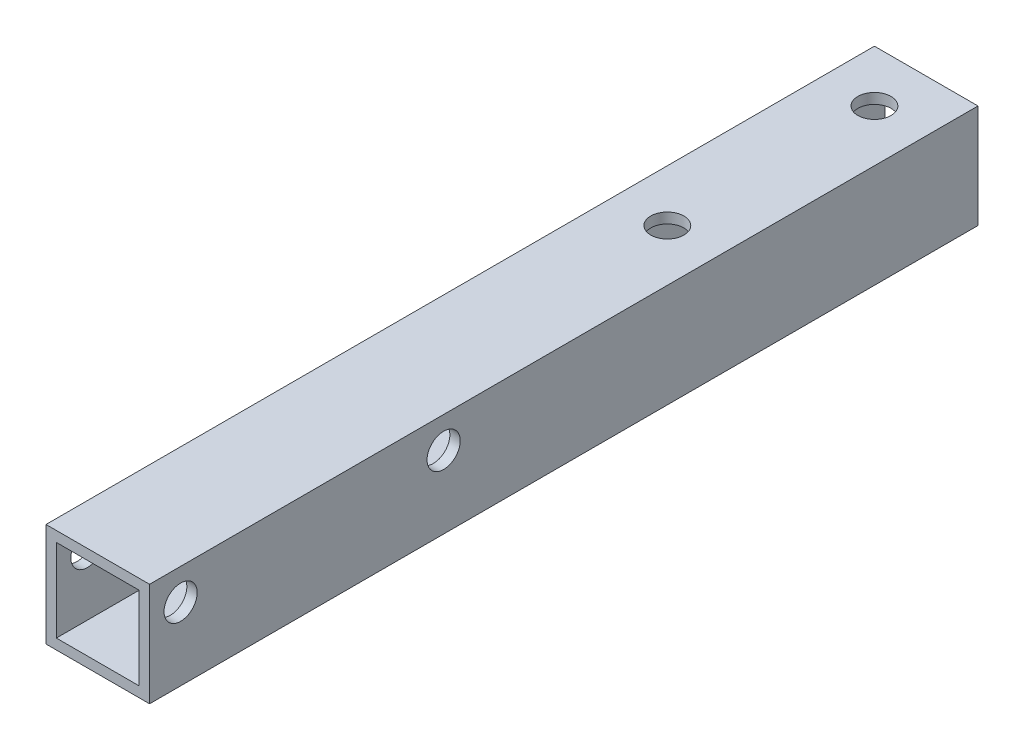
ISO-10303-21;
HEADER;
FILE_DESCRIPTION(('STEP AP214'),'2;1');
FILE_NAME('part.step','',(''),(''),'','','');
FILE_SCHEMA(('AUTOMOTIVE_DESIGN { 1 0 10303 214 1 1 1 1 }'));
ENDSEC;
DATA;
#1=APPLICATION_CONTEXT('core data for automotive mechanical design processes');
#2=APPLICATION_PROTOCOL_DEFINITION('international standard','automotive_design',2000,#1);
#3=PRODUCT_CONTEXT('',#1,'mechanical');
#4=PRODUCT('Part','Part','',(#3));
#5=PRODUCT_RELATED_PRODUCT_CATEGORY('part','',(#4));
#6=PRODUCT_DEFINITION_FORMATION('','',#4);
#7=PRODUCT_DEFINITION_CONTEXT('part definition',#1,'design');
#8=PRODUCT_DEFINITION('design','',#6,#7);
#9=PRODUCT_DEFINITION_SHAPE('','',#8);
#10=(LENGTH_UNIT() NAMED_UNIT(*) SI_UNIT(.MILLI.,.METRE.));
#11=(NAMED_UNIT(*) PLANE_ANGLE_UNIT() SI_UNIT($,.RADIAN.));
#12=(NAMED_UNIT(*) SI_UNIT($,.STERADIAN.) SOLID_ANGLE_UNIT());
#13=UNCERTAINTY_MEASURE_WITH_UNIT(LENGTH_MEASURE(1.E-05),#10,'distance_accuracy_value','');
#14=(GEOMETRIC_REPRESENTATION_CONTEXT(3) GLOBAL_UNCERTAINTY_ASSIGNED_CONTEXT((#13)) GLOBAL_UNIT_ASSIGNED_CONTEXT((#10,
#11,#12)) REPRESENTATION_CONTEXT('',''));
#15=CARTESIAN_POINT('',(0.,0.,0.));
#16=DIRECTION('',(0.,0.,1.));
#17=DIRECTION('',(1.,0.,0.));
#18=AXIS2_PLACEMENT_3D('',#15,#16,#17);
#19=CARTESIAN_POINT('',(0.,0.,80.));
#20=DIRECTION('',(0.,0.,1.));
#21=DIRECTION('',(1.,0.,0.));
#22=AXIS2_PLACEMENT_3D('',#19,#20,#21);
#23=PLANE('',#22);
#24=DIRECTION('',(0.,-1.,0.));
#25=VECTOR('',#24,1.);
#26=CARTESIAN_POINT('',(-5.,5.,80.));
#27=LINE('',#26,#25);
#28=CARTESIAN_POINT('',(-5.,5.,80.));
#29=VERTEX_POINT('',#28);
#30=CARTESIAN_POINT('',(-5.,-5.,80.));
#31=VERTEX_POINT('',#30);
#32=EDGE_CURVE('E164',#29,#31,#27,.T.);
#33=ORIENTED_EDGE('',*,*,#32,.T.);
#34=DIRECTION('',(1.,0.,0.));
#35=VECTOR('',#34,1.);
#36=CARTESIAN_POINT('',(5.,-5.,80.));
#37=LINE('',#36,#35);
#38=CARTESIAN_POINT('',(5.,-5.,80.));
#39=VERTEX_POINT('',#38);
#40=EDGE_CURVE('E167',#31,#39,#37,.T.);
#41=ORIENTED_EDGE('',*,*,#40,.T.);
#42=DIRECTION('',(0.,1.,0.));
#43=VECTOR('',#42,1.);
#44=CARTESIAN_POINT('',(5.,5.,80.));
#45=LINE('',#44,#43);
#46=CARTESIAN_POINT('',(5.,5.,80.));
#47=VERTEX_POINT('',#46);
#48=EDGE_CURVE('E170',#39,#47,#45,.T.);
#49=ORIENTED_EDGE('',*,*,#48,.T.);
#50=DIRECTION('',(-1.,0.,0.));
#51=VECTOR('',#50,1.);
#52=CARTESIAN_POINT('',(5.,5.,80.));
#53=LINE('',#52,#51);
#54=EDGE_CURVE('E172',#47,#29,#53,.T.);
#55=ORIENTED_EDGE('',*,*,#54,.T.);
#56=EDGE_LOOP('',(#33,#41,#49,#55));
#57=FACE_BOUND('',#56,.T.);
#58=DIRECTION('',(1.,0.,0.));
#59=VECTOR('',#58,1.);
#60=CARTESIAN_POINT('',(0.,-4.,80.));
#61=LINE('',#60,#59);
#62=CARTESIAN_POINT('',(-4.,-4.,80.));
#63=VERTEX_POINT('',#62);
#64=CARTESIAN_POINT('',(4.,-4.,80.));
#65=VERTEX_POINT('',#64);
#66=EDGE_CURVE('E134',#63,#65,#61,.T.);
#67=ORIENTED_EDGE('',*,*,#66,.F.);
#68=DIRECTION('',(0.,-1.,0.));
#69=VECTOR('',#68,1.);
#70=CARTESIAN_POINT('',(-4.,0.,80.));
#71=LINE('',#70,#69);
#72=CARTESIAN_POINT('',(-4.,4.,80.));
#73=VERTEX_POINT('',#72);
#74=EDGE_CURVE('E126',#73,#63,#71,.T.);
#75=ORIENTED_EDGE('',*,*,#74,.F.);
#76=DIRECTION('',(-1.,0.,0.));
#77=VECTOR('',#76,1.);
#78=CARTESIAN_POINT('',(0.,4.,80.));
#79=LINE('',#78,#77);
#80=CARTESIAN_POINT('',(4.,4.,80.));
#81=VERTEX_POINT('',#80);
#82=EDGE_CURVE('E148',#81,#73,#79,.T.);
#83=ORIENTED_EDGE('',*,*,#82,.F.);
#84=DIRECTION('',(0.,1.,0.));
#85=VECTOR('',#84,1.);
#86=CARTESIAN_POINT('',(4.,0.,80.));
#87=LINE('',#86,#85);
#88=EDGE_CURVE('E146',#65,#81,#87,.T.);
#89=ORIENTED_EDGE('',*,*,#88,.F.);
#90=EDGE_LOOP('',(#67,#75,#83,#89));
#91=FACE_BOUND('',#90,.T.);
#92=ADVANCED_FACE('F59',(#57,#91),#23,.T.);
#93=CARTESIAN_POINT('',(0.,0.,0.));
#94=DIRECTION('',(0.,0.,1.));
#95=DIRECTION('',(1.,0.,0.));
#96=AXIS2_PLACEMENT_3D('',#93,#94,#95);
#97=PLANE('',#96);
#98=DIRECTION('',(0.,-1.,0.));
#99=VECTOR('',#98,1.);
#100=CARTESIAN_POINT('',(-5.,5.,0.));
#101=LINE('',#100,#99);
#102=CARTESIAN_POINT('',(-5.,5.,0.));
#103=VERTEX_POINT('',#102);
#104=CARTESIAN_POINT('',(-5.,-5.,0.));
#105=VERTEX_POINT('',#104);
#106=EDGE_CURVE('E142',#103,#105,#101,.T.);
#107=ORIENTED_EDGE('',*,*,#106,.F.);
#108=DIRECTION('',(-1.,0.,0.));
#109=VECTOR('',#108,1.);
#110=CARTESIAN_POINT('',(5.,5.,0.));
#111=LINE('',#110,#109);
#112=CARTESIAN_POINT('',(5.,5.,0.));
#113=VERTEX_POINT('',#112);
#114=EDGE_CURVE('E168',#113,#103,#111,.T.);
#115=ORIENTED_EDGE('',*,*,#114,.F.);
#116=DIRECTION('',(0.,1.,0.));
#117=VECTOR('',#116,1.);
#118=CARTESIAN_POINT('',(5.,5.,0.));
#119=LINE('',#118,#117);
#120=CARTESIAN_POINT('',(5.,-5.,0.));
#121=VERTEX_POINT('',#120);
#122=EDGE_CURVE('E179',#121,#113,#119,.T.);
#123=ORIENTED_EDGE('',*,*,#122,.F.);
#124=DIRECTION('',(1.,0.,0.));
#125=VECTOR('',#124,1.);
#126=CARTESIAN_POINT('',(5.,-5.,0.));
#127=LINE('',#126,#125);
#128=EDGE_CURVE('E177',#105,#121,#127,.T.);
#129=ORIENTED_EDGE('',*,*,#128,.F.);
#130=EDGE_LOOP('',(#107,#115,#123,#129));
#131=FACE_BOUND('',#130,.T.);
#132=DIRECTION('',(0.,-1.,0.));
#133=VECTOR('',#132,1.);
#134=CARTESIAN_POINT('',(-4.,0.,0.));
#135=LINE('',#134,#133);
#136=CARTESIAN_POINT('',(-4.,4.,0.));
#137=VERTEX_POINT('',#136);
#138=CARTESIAN_POINT('',(-4.,-4.,0.));
#139=VERTEX_POINT('',#138);
#140=EDGE_CURVE('E84',#137,#139,#135,.T.);
#141=ORIENTED_EDGE('',*,*,#140,.T.);
#142=DIRECTION('',(1.,0.,0.));
#143=VECTOR('',#142,1.);
#144=CARTESIAN_POINT('',(0.,-4.,0.));
#145=LINE('',#144,#143);
#146=CARTESIAN_POINT('',(4.,-4.,0.));
#147=VERTEX_POINT('',#146);
#148=EDGE_CURVE('E141',#139,#147,#145,.T.);
#149=ORIENTED_EDGE('',*,*,#148,.T.);
#150=DIRECTION('',(0.,1.,0.));
#151=VECTOR('',#150,1.);
#152=CARTESIAN_POINT('',(4.,0.,0.));
#153=LINE('',#152,#151);
#154=CARTESIAN_POINT('',(4.,4.,0.));
#155=VERTEX_POINT('',#154);
#156=EDGE_CURVE('E156',#147,#155,#153,.T.);
#157=ORIENTED_EDGE('',*,*,#156,.T.);
#158=DIRECTION('',(-1.,0.,0.));
#159=VECTOR('',#158,1.);
#160=CARTESIAN_POINT('',(0.,4.,0.));
#161=LINE('',#160,#159);
#162=EDGE_CURVE('E135',#155,#137,#161,.T.);
#163=ORIENTED_EDGE('',*,*,#162,.T.);
#164=EDGE_LOOP('',(#141,#149,#157,#163));
#165=FACE_BOUND('',#164,.T.);
#166=ADVANCED_FACE('F267',(#131,#165),#97,.F.);
#167=CARTESIAN_POINT('',(-5.,5.,80.));
#168=DIRECTION('',(1.,0.,0.));
#169=DIRECTION('',(0.,1.,0.));
#170=AXIS2_PLACEMENT_3D('',#167,#168,#169);
#171=PLANE('',#170);
#172=CARTESIAN_POINT('',(-5.,2.,77.));
#173=DIRECTION('',(-1.,0.,0.));
#174=DIRECTION('',(0.,-1.,0.));
#175=AXIS2_PLACEMENT_3D('',#172,#173,#174);
#176=CIRCLE('',#175,1.60000000000001);
#177=CARTESIAN_POINT('',(-5.,0.399999999999993,77.));
#178=VERTEX_POINT('',#177);
#179=EDGE_CURVE('E205',#178,#178,#176,.T.);
#180=ORIENTED_EDGE('',*,*,#179,.F.);
#181=EDGE_LOOP('',(#180));
#182=FACE_BOUND('',#181,.T.);
#183=CARTESIAN_POINT('',(-5.,2.,51.6));
#184=DIRECTION('',(-1.,0.,0.));
#185=DIRECTION('',(0.,-1.,0.));
#186=AXIS2_PLACEMENT_3D('',#183,#184,#185);
#187=CIRCLE('',#186,1.60000000000001);
#188=CARTESIAN_POINT('',(-5.,0.399999999999993,51.6));
#189=VERTEX_POINT('',#188);
#190=EDGE_CURVE('E215',#189,#189,#187,.T.);
#191=ORIENTED_EDGE('',*,*,#190,.F.);
#192=EDGE_LOOP('',(#191));
#193=FACE_BOUND('',#192,.T.);
#194=ORIENTED_EDGE('',*,*,#106,.T.);
#195=DIRECTION('',(0.,0.,-1.));
#196=VECTOR('',#195,1.);
#197=CARTESIAN_POINT('',(-5.,-5.,80.));
#198=LINE('',#197,#196);
#199=EDGE_CURVE('E12',#31,#105,#198,.T.);
#200=ORIENTED_EDGE('',*,*,#199,.F.);
#201=ORIENTED_EDGE('',*,*,#32,.F.);
#202=DIRECTION('',(0.,0.,-1.));
#203=VECTOR('',#202,1.);
#204=CARTESIAN_POINT('',(-5.,5.,80.));
#205=LINE('',#204,#203);
#206=EDGE_CURVE('E174',#29,#103,#205,.T.);
#207=ORIENTED_EDGE('',*,*,#206,.T.);
#208=EDGE_LOOP('',(#194,#200,#201,#207));
#209=FACE_BOUND('',#208,.T.);
#210=ADVANCED_FACE('F61',(#182,#193,#209),#171,.F.);
#211=CARTESIAN_POINT('',(5.,-5.,80.));
#212=DIRECTION('',(0.,1.,0.));
#213=DIRECTION('',(-1.,0.,0.));
#214=AXIS2_PLACEMENT_3D('',#211,#212,#213);
#215=PLANE('',#214);
#216=CARTESIAN_POINT('',(0.,-5.,5.));
#217=DIRECTION('',(0.,1.,0.));
#218=DIRECTION('',(-1.,0.,0.));
#219=AXIS2_PLACEMENT_3D('',#216,#217,#218);
#220=CIRCLE('',#219,1.6);
#221=CARTESIAN_POINT('',(-1.6,-5.,5.));
#222=VERTEX_POINT('',#221);
#223=EDGE_CURVE('E193',#222,#222,#220,.T.);
#224=ORIENTED_EDGE('',*,*,#223,.T.);
#225=EDGE_LOOP('',(#224));
#226=FACE_BOUND('',#225,.T.);
#227=CARTESIAN_POINT('',(0.,-5.,25.));
#228=DIRECTION('',(0.,1.,0.));
#229=DIRECTION('',(-1.,0.,0.));
#230=AXIS2_PLACEMENT_3D('',#227,#228,#229);
#231=CIRCLE('',#230,1.6);
#232=CARTESIAN_POINT('',(-1.6,-5.,25.));
#233=VERTEX_POINT('',#232);
#234=EDGE_CURVE('E227',#233,#233,#231,.T.);
#235=ORIENTED_EDGE('',*,*,#234,.T.);
#236=EDGE_LOOP('',(#235));
#237=FACE_BOUND('',#236,.T.);
#238=ORIENTED_EDGE('',*,*,#128,.T.);
#239=DIRECTION('',(0.,0.,-1.));
#240=VECTOR('',#239,1.);
#241=CARTESIAN_POINT('',(5.,-5.,80.));
#242=LINE('',#241,#240);
#243=EDGE_CURVE('E68',#39,#121,#242,.T.);
#244=ORIENTED_EDGE('',*,*,#243,.F.);
#245=ORIENTED_EDGE('',*,*,#40,.F.);
#246=ORIENTED_EDGE('',*,*,#199,.T.);
#247=EDGE_LOOP('',(#238,#244,#245,#246));
#248=FACE_BOUND('',#247,.T.);
#249=ADVANCED_FACE('F253',(#226,#237,#248),#215,.F.);
#250=CARTESIAN_POINT('',(5.,5.,80.));
#251=DIRECTION('',(-1.,0.,0.));
#252=DIRECTION('',(0.,-1.,0.));
#253=AXIS2_PLACEMENT_3D('',#250,#251,#252);
#254=PLANE('',#253);
#255=CARTESIAN_POINT('',(5.,2.,77.));
#256=DIRECTION('',(-1.,0.,0.));
#257=DIRECTION('',(0.,-1.,0.));
#258=AXIS2_PLACEMENT_3D('',#255,#256,#257);
#259=CIRCLE('',#258,1.60000000000001);
#260=CARTESIAN_POINT('',(5.,0.399999999999994,77.));
#261=VERTEX_POINT('',#260);
#262=EDGE_CURVE('E199',#261,#261,#259,.T.);
#263=ORIENTED_EDGE('',*,*,#262,.T.);
#264=EDGE_LOOP('',(#263));
#265=FACE_BOUND('',#264,.T.);
#266=CARTESIAN_POINT('',(5.,2.,51.6));
#267=DIRECTION('',(-1.,0.,0.));
#268=DIRECTION('',(0.,-1.,0.));
#269=AXIS2_PLACEMENT_3D('',#266,#267,#268);
#270=CIRCLE('',#269,1.60000000000001);
#271=CARTESIAN_POINT('',(5.,0.399999999999994,51.6));
#272=VERTEX_POINT('',#271);
#273=EDGE_CURVE('E210',#272,#272,#270,.T.);
#274=ORIENTED_EDGE('',*,*,#273,.T.);
#275=EDGE_LOOP('',(#274));
#276=FACE_BOUND('',#275,.T.);
#277=ORIENTED_EDGE('',*,*,#122,.T.);
#278=DIRECTION('',(0.,0.,-1.));
#279=VECTOR('',#278,1.);
#280=CARTESIAN_POINT('',(5.,5.,80.));
#281=LINE('',#280,#279);
#282=EDGE_CURVE('E184',#47,#113,#281,.T.);
#283=ORIENTED_EDGE('',*,*,#282,.F.);
#284=ORIENTED_EDGE('',*,*,#48,.F.);
#285=ORIENTED_EDGE('',*,*,#243,.T.);
#286=EDGE_LOOP('',(#277,#283,#284,#285));
#287=FACE_BOUND('',#286,.T.);
#288=ADVANCED_FACE('F256',(#265,#276,#287),#254,.F.);
#289=CARTESIAN_POINT('',(5.,5.,80.));
#290=DIRECTION('',(0.,-1.,0.));
#291=DIRECTION('',(1.,0.,0.));
#292=AXIS2_PLACEMENT_3D('',#289,#290,#291);
#293=PLANE('',#292);
#294=CARTESIAN_POINT('',(0.,5.,5.));
#295=DIRECTION('',(0.,1.,0.));
#296=DIRECTION('',(-1.,0.,0.));
#297=AXIS2_PLACEMENT_3D('',#294,#295,#296);
#298=CIRCLE('',#297,1.6);
#299=CARTESIAN_POINT('',(-1.6,5.,5.));
#300=VERTEX_POINT('',#299);
#301=EDGE_CURVE('E224',#300,#300,#298,.T.);
#302=ORIENTED_EDGE('',*,*,#301,.F.);
#303=EDGE_LOOP('',(#302));
#304=FACE_BOUND('',#303,.T.);
#305=CARTESIAN_POINT('',(0.,5.,25.));
#306=DIRECTION('',(0.,1.,0.));
#307=DIRECTION('',(-1.,0.,0.));
#308=AXIS2_PLACEMENT_3D('',#305,#306,#307);
#309=CIRCLE('',#308,1.6);
#310=CARTESIAN_POINT('',(-1.6,5.,25.));
#311=VERTEX_POINT('',#310);
#312=EDGE_CURVE('E221',#311,#311,#309,.T.);
#313=ORIENTED_EDGE('',*,*,#312,.F.);
#314=EDGE_LOOP('',(#313));
#315=FACE_BOUND('',#314,.T.);
#316=ORIENTED_EDGE('',*,*,#114,.T.);
#317=ORIENTED_EDGE('',*,*,#206,.F.);
#318=ORIENTED_EDGE('',*,*,#54,.F.);
#319=ORIENTED_EDGE('',*,*,#282,.T.);
#320=EDGE_LOOP('',(#316,#317,#318,#319));
#321=FACE_BOUND('',#320,.T.);
#322=ADVANCED_FACE('F271',(#304,#315,#321),#293,.F.);
#323=CARTESIAN_POINT('',(-4.,0.,80.));
#324=DIRECTION('',(1.,0.,0.));
#325=DIRECTION('',(0.,1.,0.));
#326=AXIS2_PLACEMENT_3D('',#323,#324,#325);
#327=PLANE('',#326);
#328=CARTESIAN_POINT('',(-4.,2.,77.));
#329=DIRECTION('',(1.,0.,0.));
#330=DIRECTION('',(0.,1.,0.));
#331=AXIS2_PLACEMENT_3D('',#328,#329,#330);
#332=CIRCLE('',#331,1.60000000000001);
#333=CARTESIAN_POINT('',(-4.,3.6,77.));
#334=VERTEX_POINT('',#333);
#335=EDGE_CURVE('E218',#334,#334,#332,.T.);
#336=ORIENTED_EDGE('',*,*,#335,.F.);
#337=EDGE_LOOP('',(#336));
#338=FACE_BOUND('',#337,.T.);
#339=CARTESIAN_POINT('',(-4.,2.,51.6));
#340=DIRECTION('',(1.,0.,0.));
#341=DIRECTION('',(0.,1.,0.));
#342=AXIS2_PLACEMENT_3D('',#339,#340,#341);
#343=CIRCLE('',#342,1.60000000000001);
#344=CARTESIAN_POINT('',(-4.,3.6,51.6));
#345=VERTEX_POINT('',#344);
#346=EDGE_CURVE('E198',#345,#345,#343,.T.);
#347=ORIENTED_EDGE('',*,*,#346,.F.);
#348=EDGE_LOOP('',(#347));
#349=FACE_BOUND('',#348,.T.);
#350=ORIENTED_EDGE('',*,*,#140,.F.);
#351=DIRECTION('',(0.,0.,-1.));
#352=VECTOR('',#351,1.);
#353=CARTESIAN_POINT('',(-4.,4.,80.));
#354=LINE('',#353,#352);
#355=EDGE_CURVE('E130',#73,#137,#354,.T.);
#356=ORIENTED_EDGE('',*,*,#355,.F.);
#357=ORIENTED_EDGE('',*,*,#74,.T.);
#358=DIRECTION('',(0.,0.,-1.));
#359=VECTOR('',#358,1.);
#360=CARTESIAN_POINT('',(-4.,-4.,80.));
#361=LINE('',#360,#359);
#362=EDGE_CURVE('E129',#63,#139,#361,.T.);
#363=ORIENTED_EDGE('',*,*,#362,.T.);
#364=EDGE_LOOP('',(#350,#356,#357,#363));
#365=FACE_BOUND('',#364,.T.);
#366=ADVANCED_FACE('F128',(#338,#349,#365),#327,.T.);
#367=CARTESIAN_POINT('',(0.,-4.,80.));
#368=DIRECTION('',(0.,1.,0.));
#369=DIRECTION('',(-1.,0.,0.));
#370=AXIS2_PLACEMENT_3D('',#367,#368,#369);
#371=PLANE('',#370);
#372=CARTESIAN_POINT('',(0.,-4.,5.));
#373=DIRECTION('',(0.,1.,0.));
#374=DIRECTION('',(-1.,0.,0.));
#375=AXIS2_PLACEMENT_3D('',#372,#373,#374);
#376=CIRCLE('',#375,1.6);
#377=CARTESIAN_POINT('',(-1.6,-4.,5.));
#378=VERTEX_POINT('',#377);
#379=EDGE_CURVE('E154',#378,#378,#376,.T.);
#380=ORIENTED_EDGE('',*,*,#379,.F.);
#381=EDGE_LOOP('',(#380));
#382=FACE_BOUND('',#381,.T.);
#383=CARTESIAN_POINT('',(0.,-4.,25.));
#384=DIRECTION('',(0.,1.,0.));
#385=DIRECTION('',(-1.,0.,0.));
#386=AXIS2_PLACEMENT_3D('',#383,#384,#385);
#387=CIRCLE('',#386,1.6);
#388=CARTESIAN_POINT('',(-1.6,-4.,25.));
#389=VERTEX_POINT('',#388);
#390=EDGE_CURVE('E192',#389,#389,#387,.T.);
#391=ORIENTED_EDGE('',*,*,#390,.F.);
#392=EDGE_LOOP('',(#391));
#393=FACE_BOUND('',#392,.T.);
#394=ORIENTED_EDGE('',*,*,#148,.F.);
#395=ORIENTED_EDGE('',*,*,#362,.F.);
#396=ORIENTED_EDGE('',*,*,#66,.T.);
#397=DIRECTION('',(0.,0.,-1.));
#398=VECTOR('',#397,1.);
#399=CARTESIAN_POINT('',(4.,-4.,80.));
#400=LINE('',#399,#398);
#401=EDGE_CURVE('E143',#65,#147,#400,.T.);
#402=ORIENTED_EDGE('',*,*,#401,.T.);
#403=EDGE_LOOP('',(#394,#395,#396,#402));
#404=FACE_BOUND('',#403,.T.);
#405=ADVANCED_FACE('F138',(#382,#393,#404),#371,.T.);
#406=CARTESIAN_POINT('',(4.,0.,80.));
#407=DIRECTION('',(-1.,0.,0.));
#408=DIRECTION('',(0.,-1.,0.));
#409=AXIS2_PLACEMENT_3D('',#406,#407,#408);
#410=PLANE('',#409);
#411=CARTESIAN_POINT('',(4.,2.,77.));
#412=DIRECTION('',(-1.,0.,0.));
#413=DIRECTION('',(0.,-1.,0.));
#414=AXIS2_PLACEMENT_3D('',#411,#412,#413);
#415=CIRCLE('',#414,1.60000000000001);
#416=CARTESIAN_POINT('',(4.,0.399999999999994,77.));
#417=VERTEX_POINT('',#416);
#418=EDGE_CURVE('E63',#417,#417,#415,.T.);
#419=ORIENTED_EDGE('',*,*,#418,.F.);
#420=EDGE_LOOP('',(#419));
#421=FACE_BOUND('',#420,.T.);
#422=CARTESIAN_POINT('',(4.,2.,51.6));
#423=DIRECTION('',(-1.,0.,0.));
#424=DIRECTION('',(0.,-1.,0.));
#425=AXIS2_PLACEMENT_3D('',#422,#423,#424);
#426=CIRCLE('',#425,1.60000000000001);
#427=CARTESIAN_POINT('',(4.,0.399999999999994,51.6));
#428=VERTEX_POINT('',#427);
#429=EDGE_CURVE('E196',#428,#428,#426,.T.);
#430=ORIENTED_EDGE('',*,*,#429,.F.);
#431=EDGE_LOOP('',(#430));
#432=FACE_BOUND('',#431,.T.);
#433=ORIENTED_EDGE('',*,*,#156,.F.);
#434=ORIENTED_EDGE('',*,*,#401,.F.);
#435=ORIENTED_EDGE('',*,*,#88,.T.);
#436=DIRECTION('',(0.,0.,-1.));
#437=VECTOR('',#436,1.);
#438=CARTESIAN_POINT('',(4.,4.,80.));
#439=LINE('',#438,#437);
#440=EDGE_CURVE('E76',#81,#155,#439,.T.);
#441=ORIENTED_EDGE('',*,*,#440,.T.);
#442=EDGE_LOOP('',(#433,#434,#435,#441));
#443=FACE_BOUND('',#442,.T.);
#444=ADVANCED_FACE('F241',(#421,#432,#443),#410,.T.);
#445=CARTESIAN_POINT('',(0.,4.,80.));
#446=DIRECTION('',(0.,-1.,0.));
#447=DIRECTION('',(1.,0.,0.));
#448=AXIS2_PLACEMENT_3D('',#445,#446,#447);
#449=PLANE('',#448);
#450=CARTESIAN_POINT('',(0.,4.,5.));
#451=DIRECTION('',(0.,-1.,0.));
#452=DIRECTION('',(1.,0.,0.));
#453=AXIS2_PLACEMENT_3D('',#450,#451,#452);
#454=CIRCLE('',#453,1.6);
#455=CARTESIAN_POINT('',(-1.6,4.,5.));
#456=VERTEX_POINT('',#455);
#457=EDGE_CURVE('E194',#456,#456,#454,.T.);
#458=ORIENTED_EDGE('',*,*,#457,.F.);
#459=EDGE_LOOP('',(#458));
#460=FACE_BOUND('',#459,.T.);
#461=CARTESIAN_POINT('',(0.,4.,25.));
#462=DIRECTION('',(0.,-1.,0.));
#463=DIRECTION('',(1.,0.,0.));
#464=AXIS2_PLACEMENT_3D('',#461,#462,#463);
#465=CIRCLE('',#464,1.6);
#466=CARTESIAN_POINT('',(-1.6,4.,25.));
#467=VERTEX_POINT('',#466);
#468=EDGE_CURVE('E189',#467,#467,#465,.T.);
#469=ORIENTED_EDGE('',*,*,#468,.F.);
#470=EDGE_LOOP('',(#469));
#471=FACE_BOUND('',#470,.T.);
#472=ORIENTED_EDGE('',*,*,#162,.F.);
#473=ORIENTED_EDGE('',*,*,#440,.F.);
#474=ORIENTED_EDGE('',*,*,#82,.T.);
#475=ORIENTED_EDGE('',*,*,#355,.T.);
#476=EDGE_LOOP('',(#472,#473,#474,#475));
#477=FACE_BOUND('',#476,.T.);
#478=ADVANCED_FACE('F353',(#460,#471,#477),#449,.T.);
#479=CARTESIAN_POINT('',(0.,-5.,25.));
#480=DIRECTION('',(0.,1.,0.));
#481=DIRECTION('',(-1.,0.,0.));
#482=AXIS2_PLACEMENT_3D('',#479,#480,#481);
#483=CYLINDRICAL_SURFACE('',#482,1.6);
#484=CARTESIAN_POINT('',(-1.6,4.,25.));
#485=CARTESIAN_POINT('',(-1.6,4.01041666666667,25.));
#486=CARTESIAN_POINT('',(-1.6,4.02083333333333,25.));
#487=CARTESIAN_POINT('',(-1.6,4.04166666666667,25.));
#488=CARTESIAN_POINT('',(-1.6,4.05208333333333,25.));
#489=CARTESIAN_POINT('',(-1.6,4.07291666666667,25.));
#490=CARTESIAN_POINT('',(-1.6,4.08333333333333,25.));
#491=CARTESIAN_POINT('',(-1.6,4.10416666666667,25.));
#492=CARTESIAN_POINT('',(-1.6,4.11458333333333,25.));
#493=CARTESIAN_POINT('',(-1.6,4.13541666666667,25.));
#494=CARTESIAN_POINT('',(-1.6,4.14583333333333,25.));
#495=CARTESIAN_POINT('',(-1.6,4.16666666666667,25.));
#496=CARTESIAN_POINT('',(-1.6,4.17708333333333,25.));
#497=CARTESIAN_POINT('',(-1.6,4.19791666666667,25.));
#498=CARTESIAN_POINT('',(-1.6,4.20833333333333,25.));
#499=CARTESIAN_POINT('',(-1.6,4.22916666666667,25.));
#500=CARTESIAN_POINT('',(-1.6,4.23958333333333,25.));
#501=CARTESIAN_POINT('',(-1.6,4.26041666666667,25.));
#502=CARTESIAN_POINT('',(-1.6,4.27083333333333,25.));
#503=CARTESIAN_POINT('',(-1.6,4.29166666666667,25.));
#504=CARTESIAN_POINT('',(-1.6,4.30208333333333,25.));
#505=CARTESIAN_POINT('',(-1.6,4.32291666666667,25.));
#506=CARTESIAN_POINT('',(-1.6,4.33333333333333,25.));
#507=CARTESIAN_POINT('',(-1.6,4.35416666666667,25.));
#508=CARTESIAN_POINT('',(-1.6,4.36458333333333,25.));
#509=CARTESIAN_POINT('',(-1.6,4.38541666666667,25.));
#510=CARTESIAN_POINT('',(-1.6,4.39583333333333,25.));
#511=CARTESIAN_POINT('',(-1.6,4.41666666666667,25.));
#512=CARTESIAN_POINT('',(-1.6,4.42708333333333,25.));
#513=CARTESIAN_POINT('',(-1.6,4.44791666666667,25.));
#514=CARTESIAN_POINT('',(-1.6,4.45833333333333,25.));
#515=CARTESIAN_POINT('',(-1.6,4.47916666666667,25.));
#516=CARTESIAN_POINT('',(-1.6,4.48958333333333,25.));
#517=CARTESIAN_POINT('',(-1.6,4.51041666666667,25.));
#518=CARTESIAN_POINT('',(-1.6,4.52083333333333,25.));
#519=CARTESIAN_POINT('',(-1.6,4.54166666666667,25.));
#520=CARTESIAN_POINT('',(-1.6,4.55208333333333,25.));
#521=CARTESIAN_POINT('',(-1.6,4.57291666666667,25.));
#522=CARTESIAN_POINT('',(-1.6,4.58333333333333,25.));
#523=CARTESIAN_POINT('',(-1.6,4.60416666666667,25.));
#524=CARTESIAN_POINT('',(-1.6,4.61458333333333,25.));
#525=CARTESIAN_POINT('',(-1.6,4.63541666666667,25.));
#526=CARTESIAN_POINT('',(-1.6,4.64583333333333,25.));
#527=CARTESIAN_POINT('',(-1.6,4.66666666666667,25.));
#528=CARTESIAN_POINT('',(-1.6,4.67708333333333,25.));
#529=CARTESIAN_POINT('',(-1.6,4.69791666666667,25.));
#530=CARTESIAN_POINT('',(-1.6,4.70833333333333,25.));
#531=CARTESIAN_POINT('',(-1.6,4.72916666666667,25.));
#532=CARTESIAN_POINT('',(-1.6,4.73958333333333,25.));
#533=CARTESIAN_POINT('',(-1.6,4.76041666666667,25.));
#534=CARTESIAN_POINT('',(-1.6,4.77083333333333,25.));
#535=CARTESIAN_POINT('',(-1.6,4.79166666666667,25.));
#536=CARTESIAN_POINT('',(-1.6,4.80208333333333,25.));
#537=CARTESIAN_POINT('',(-1.6,4.82291666666667,25.));
#538=CARTESIAN_POINT('',(-1.6,4.83333333333333,25.));
#539=CARTESIAN_POINT('',(-1.6,4.85416666666667,25.));
#540=CARTESIAN_POINT('',(-1.6,4.86458333333333,25.));
#541=CARTESIAN_POINT('',(-1.6,4.88541666666667,25.));
#542=CARTESIAN_POINT('',(-1.6,4.89583333333333,25.));
#543=CARTESIAN_POINT('',(-1.6,4.91666666666667,25.));
#544=CARTESIAN_POINT('',(-1.6,4.92708333333333,25.));
#545=CARTESIAN_POINT('',(-1.6,4.94791666666667,25.));
#546=CARTESIAN_POINT('',(-1.6,4.95833333333333,25.));
#547=CARTESIAN_POINT('',(-1.6,4.97916666666667,25.));
#548=CARTESIAN_POINT('',(-1.6,4.98958333333333,25.));
#549=CARTESIAN_POINT('',(-1.6,5.,25.));
#550=B_SPLINE_CURVE_WITH_KNOTS('',3,(#484,#485,#486,#487,#488,#489,#490,#491,#492,#493,#494,
#495,#496,#497,#498,#499,#500,#501,#502,#503,#504,#505,#506,#507,#508,#509,#510,#511,#512,#513,
#514,#515,#516,#517,#518,#519,#520,#521,#522,#523,#524,#525,#526,#527,#528,#529,#530,#531,#532,
#533,#534,#535,#536,#537,#538,#539,#540,#541,#542,#543,#544,#545,#546,#547,#548,#549),
.UNSPECIFIED.,.F.,.F.,(4,2,2,2,2,2,2,2,2,2,2,2,2,2,2,2,2,2,2,2,2,2,2,2,2,2,2,2,2,2,2,2,4),(0.,
0.03125,0.0625000000000001,0.0937500000000001,0.125,0.15625,0.1875,0.21875,0.25,0.28125,0.3125,
0.34375,0.375,0.40625,0.4375,0.46875,0.5,0.53125,0.5625,0.593750000000001,0.625000000000001,
0.656250000000001,0.687500000000001,0.718750000000001,0.750000000000001,0.781250000000001,
0.812500000000001,0.843750000000001,0.875000000000001,0.906250000000001,0.937500000000001,
0.968750000000001,1.),.UNSPECIFIED.);
#551=EDGE_CURVE('BSEAM250',#467,#311,#550,.T.);
#552=ORIENTED_EDGE('',*,*,#468,.T.);
#553=ORIENTED_EDGE('',*,*,#312,.T.);
#554=ORIENTED_EDGE('',*,*,#551,.T.);
#555=ORIENTED_EDGE('',*,*,#551,.F.);
#556=EDGE_LOOP('',(#552,#554,#553,#555));
#557=FACE_BOUND('',#556,.T.);
#558=ADVANCED_FACE('F250',(#557),#483,.F.);
#559=CARTESIAN_POINT('',(0.,-5.,5.));
#560=DIRECTION('',(0.,1.,0.));
#561=DIRECTION('',(-1.,0.,0.));
#562=AXIS2_PLACEMENT_3D('',#559,#560,#561);
#563=CYLINDRICAL_SURFACE('',#562,1.6);
#564=CARTESIAN_POINT('',(-1.6,4.,5.));
#565=CARTESIAN_POINT('',(-1.6,4.01041666666667,5.));
#566=CARTESIAN_POINT('',(-1.6,4.02083333333333,5.));
#567=CARTESIAN_POINT('',(-1.6,4.04166666666667,5.));
#568=CARTESIAN_POINT('',(-1.6,4.05208333333333,5.));
#569=CARTESIAN_POINT('',(-1.6,4.07291666666667,5.));
#570=CARTESIAN_POINT('',(-1.6,4.08333333333333,5.));
#571=CARTESIAN_POINT('',(-1.6,4.10416666666667,5.));
#572=CARTESIAN_POINT('',(-1.6,4.11458333333333,5.));
#573=CARTESIAN_POINT('',(-1.6,4.13541666666667,5.));
#574=CARTESIAN_POINT('',(-1.6,4.14583333333333,5.));
#575=CARTESIAN_POINT('',(-1.6,4.16666666666667,5.));
#576=CARTESIAN_POINT('',(-1.6,4.17708333333333,5.));
#577=CARTESIAN_POINT('',(-1.6,4.19791666666667,5.));
#578=CARTESIAN_POINT('',(-1.6,4.20833333333333,5.));
#579=CARTESIAN_POINT('',(-1.6,4.22916666666667,5.));
#580=CARTESIAN_POINT('',(-1.6,4.23958333333333,5.));
#581=CARTESIAN_POINT('',(-1.6,4.26041666666667,5.));
#582=CARTESIAN_POINT('',(-1.6,4.27083333333333,5.));
#583=CARTESIAN_POINT('',(-1.6,4.29166666666667,5.));
#584=CARTESIAN_POINT('',(-1.6,4.30208333333333,5.));
#585=CARTESIAN_POINT('',(-1.6,4.32291666666667,5.));
#586=CARTESIAN_POINT('',(-1.6,4.33333333333333,5.));
#587=CARTESIAN_POINT('',(-1.6,4.35416666666667,5.));
#588=CARTESIAN_POINT('',(-1.6,4.36458333333333,5.));
#589=CARTESIAN_POINT('',(-1.6,4.38541666666667,5.));
#590=CARTESIAN_POINT('',(-1.6,4.39583333333333,5.));
#591=CARTESIAN_POINT('',(-1.6,4.41666666666667,5.));
#592=CARTESIAN_POINT('',(-1.6,4.42708333333333,5.));
#593=CARTESIAN_POINT('',(-1.6,4.44791666666667,5.));
#594=CARTESIAN_POINT('',(-1.6,4.45833333333333,5.));
#595=CARTESIAN_POINT('',(-1.6,4.47916666666667,5.));
#596=CARTESIAN_POINT('',(-1.6,4.48958333333333,5.));
#597=CARTESIAN_POINT('',(-1.6,4.51041666666667,5.));
#598=CARTESIAN_POINT('',(-1.6,4.52083333333333,5.));
#599=CARTESIAN_POINT('',(-1.6,4.54166666666667,5.));
#600=CARTESIAN_POINT('',(-1.6,4.55208333333333,5.));
#601=CARTESIAN_POINT('',(-1.6,4.57291666666667,5.));
#602=CARTESIAN_POINT('',(-1.6,4.58333333333333,5.));
#603=CARTESIAN_POINT('',(-1.6,4.60416666666667,5.));
#604=CARTESIAN_POINT('',(-1.6,4.61458333333333,5.));
#605=CARTESIAN_POINT('',(-1.6,4.63541666666667,5.));
#606=CARTESIAN_POINT('',(-1.6,4.64583333333333,5.));
#607=CARTESIAN_POINT('',(-1.6,4.66666666666667,5.));
#608=CARTESIAN_POINT('',(-1.6,4.67708333333333,5.));
#609=CARTESIAN_POINT('',(-1.6,4.69791666666667,5.));
#610=CARTESIAN_POINT('',(-1.6,4.70833333333333,5.));
#611=CARTESIAN_POINT('',(-1.6,4.72916666666667,5.));
#612=CARTESIAN_POINT('',(-1.6,4.73958333333333,5.));
#613=CARTESIAN_POINT('',(-1.6,4.76041666666667,5.));
#614=CARTESIAN_POINT('',(-1.6,4.77083333333333,5.));
#615=CARTESIAN_POINT('',(-1.6,4.79166666666667,5.));
#616=CARTESIAN_POINT('',(-1.6,4.80208333333333,5.));
#617=CARTESIAN_POINT('',(-1.6,4.82291666666667,5.));
#618=CARTESIAN_POINT('',(-1.6,4.83333333333333,5.));
#619=CARTESIAN_POINT('',(-1.6,4.85416666666667,5.));
#620=CARTESIAN_POINT('',(-1.6,4.86458333333333,5.));
#621=CARTESIAN_POINT('',(-1.6,4.88541666666667,5.));
#622=CARTESIAN_POINT('',(-1.6,4.89583333333333,5.));
#623=CARTESIAN_POINT('',(-1.6,4.91666666666667,5.));
#624=CARTESIAN_POINT('',(-1.6,4.92708333333333,5.));
#625=CARTESIAN_POINT('',(-1.6,4.94791666666667,5.));
#626=CARTESIAN_POINT('',(-1.6,4.95833333333333,5.));
#627=CARTESIAN_POINT('',(-1.6,4.97916666666667,5.));
#628=CARTESIAN_POINT('',(-1.6,4.98958333333333,5.));
#629=CARTESIAN_POINT('',(-1.6,5.,5.));
#630=B_SPLINE_CURVE_WITH_KNOTS('',3,(#564,#565,#566,#567,#568,#569,#570,#571,#572,#573,#574,
#575,#576,#577,#578,#579,#580,#581,#582,#583,#584,#585,#586,#587,#588,#589,#590,#591,#592,#593,
#594,#595,#596,#597,#598,#599,#600,#601,#602,#603,#604,#605,#606,#607,#608,#609,#610,#611,#612,
#613,#614,#615,#616,#617,#618,#619,#620,#621,#622,#623,#624,#625,#626,#627,#628,#629),
.UNSPECIFIED.,.F.,.F.,(4,2,2,2,2,2,2,2,2,2,2,2,2,2,2,2,2,2,2,2,2,2,2,2,2,2,2,2,2,2,2,2,4),(0.,
0.03125,0.0625000000000001,0.0937500000000001,0.125,0.15625,0.1875,0.21875,0.25,0.28125,0.3125,
0.34375,0.375,0.40625,0.4375,0.46875,0.5,0.53125,0.5625,0.593750000000001,0.625000000000001,
0.656250000000001,0.687500000000001,0.718750000000001,0.750000000000001,0.781250000000001,
0.812500000000001,0.843750000000001,0.875000000000001,0.906250000000001,0.937500000000001,
0.968750000000001,1.),.UNSPECIFIED.);
#631=EDGE_CURVE('BSEAM248',#456,#300,#630,.T.);
#632=ORIENTED_EDGE('',*,*,#457,.T.);
#633=ORIENTED_EDGE('',*,*,#301,.T.);
#634=ORIENTED_EDGE('',*,*,#631,.T.);
#635=ORIENTED_EDGE('',*,*,#631,.F.);
#636=EDGE_LOOP('',(#632,#634,#633,#635));
#637=FACE_BOUND('',#636,.T.);
#638=ADVANCED_FACE('F248',(#637),#563,.F.);
#639=CARTESIAN_POINT('',(-1.6,-4.,25.));
#640=CARTESIAN_POINT('',(-1.6,-4.01041666666667,25.));
#641=CARTESIAN_POINT('',(-1.6,-4.02083333333333,25.));
#642=CARTESIAN_POINT('',(-1.6,-4.04166666666667,25.));
#643=CARTESIAN_POINT('',(-1.6,-4.05208333333333,25.));
#644=CARTESIAN_POINT('',(-1.6,-4.07291666666667,25.));
#645=CARTESIAN_POINT('',(-1.6,-4.08333333333333,25.));
#646=CARTESIAN_POINT('',(-1.6,-4.10416666666667,25.));
#647=CARTESIAN_POINT('',(-1.6,-4.11458333333333,25.));
#648=CARTESIAN_POINT('',(-1.6,-4.13541666666667,25.));
#649=CARTESIAN_POINT('',(-1.6,-4.14583333333333,25.));
#650=CARTESIAN_POINT('',(-1.6,-4.16666666666667,25.));
#651=CARTESIAN_POINT('',(-1.6,-4.17708333333334,25.));
#652=CARTESIAN_POINT('',(-1.6,-4.19791666666667,25.));
#653=CARTESIAN_POINT('',(-1.6,-4.20833333333334,25.));
#654=CARTESIAN_POINT('',(-1.6,-4.22916666666667,25.));
#655=CARTESIAN_POINT('',(-1.6,-4.23958333333334,25.));
#656=CARTESIAN_POINT('',(-1.6,-4.26041666666667,25.));
#657=CARTESIAN_POINT('',(-1.6,-4.27083333333334,25.));
#658=CARTESIAN_POINT('',(-1.6,-4.29166666666667,25.));
#659=CARTESIAN_POINT('',(-1.6,-4.30208333333334,25.));
#660=CARTESIAN_POINT('',(-1.6,-4.32291666666667,25.));
#661=CARTESIAN_POINT('',(-1.6,-4.33333333333334,25.));
#662=CARTESIAN_POINT('',(-1.6,-4.35416666666667,25.));
#663=CARTESIAN_POINT('',(-1.6,-4.36458333333334,25.));
#664=CARTESIAN_POINT('',(-1.6,-4.38541666666667,25.));
#665=CARTESIAN_POINT('',(-1.6,-4.39583333333334,25.));
#666=CARTESIAN_POINT('',(-1.6,-4.41666666666667,25.));
#667=CARTESIAN_POINT('',(-1.6,-4.42708333333334,25.));
#668=CARTESIAN_POINT('',(-1.6,-4.44791666666667,25.));
#669=CARTESIAN_POINT('',(-1.6,-4.45833333333334,25.));
#670=CARTESIAN_POINT('',(-1.6,-4.47916666666667,25.));
#671=CARTESIAN_POINT('',(-1.6,-4.48958333333334,25.));
#672=CARTESIAN_POINT('',(-1.6,-4.51041666666667,25.));
#673=CARTESIAN_POINT('',(-1.6,-4.52083333333334,25.));
#674=CARTESIAN_POINT('',(-1.6,-4.54166666666667,25.));
#675=CARTESIAN_POINT('',(-1.6,-4.55208333333334,25.));
#676=CARTESIAN_POINT('',(-1.6,-4.57291666666667,25.));
#677=CARTESIAN_POINT('',(-1.6,-4.58333333333334,25.));
#678=CARTESIAN_POINT('',(-1.6,-4.60416666666667,25.));
#679=CARTESIAN_POINT('',(-1.6,-4.61458333333334,25.));
#680=CARTESIAN_POINT('',(-1.6,-4.63541666666667,25.));
#681=CARTESIAN_POINT('',(-1.6,-4.64583333333334,25.));
#682=CARTESIAN_POINT('',(-1.6,-4.66666666666667,25.));
#683=CARTESIAN_POINT('',(-1.6,-4.67708333333334,25.));
#684=CARTESIAN_POINT('',(-1.6,-4.69791666666667,25.));
#685=CARTESIAN_POINT('',(-1.6,-4.70833333333334,25.));
#686=CARTESIAN_POINT('',(-1.6,-4.72916666666667,25.));
#687=CARTESIAN_POINT('',(-1.6,-4.73958333333334,25.));
#688=CARTESIAN_POINT('',(-1.6,-4.76041666666667,25.));
#689=CARTESIAN_POINT('',(-1.6,-4.77083333333334,25.));
#690=CARTESIAN_POINT('',(-1.6,-4.79166666666667,25.));
#691=CARTESIAN_POINT('',(-1.6,-4.80208333333334,25.));
#692=CARTESIAN_POINT('',(-1.6,-4.82291666666667,25.));
#693=CARTESIAN_POINT('',(-1.6,-4.83333333333334,25.));
#694=CARTESIAN_POINT('',(-1.6,-4.85416666666667,25.));
#695=CARTESIAN_POINT('',(-1.6,-4.86458333333334,25.));
#696=CARTESIAN_POINT('',(-1.6,-4.88541666666667,25.));
#697=CARTESIAN_POINT('',(-1.6,-4.89583333333334,25.));
#698=CARTESIAN_POINT('',(-1.6,-4.91666666666667,25.));
#699=CARTESIAN_POINT('',(-1.6,-4.92708333333334,25.));
#700=CARTESIAN_POINT('',(-1.6,-4.94791666666667,25.));
#701=CARTESIAN_POINT('',(-1.6,-4.95833333333334,25.));
#702=CARTESIAN_POINT('',(-1.6,-4.97916666666667,25.));
#703=CARTESIAN_POINT('',(-1.6,-4.98958333333334,25.));
#704=CARTESIAN_POINT('',(-1.6,-5.,25.));
#705=B_SPLINE_CURVE_WITH_KNOTS('',3,(#639,#640,#641,#642,#643,#644,#645,#646,#647,#648,#649,
#650,#651,#652,#653,#654,#655,#656,#657,#658,#659,#660,#661,#662,#663,#664,#665,#666,#667,#668,
#669,#670,#671,#672,#673,#674,#675,#676,#677,#678,#679,#680,#681,#682,#683,#684,#685,#686,#687,
#688,#689,#690,#691,#692,#693,#694,#695,#696,#697,#698,#699,#700,#701,#702,#703,#704),
.UNSPECIFIED.,.F.,.F.,(4,2,2,2,2,2,2,2,2,2,2,2,2,2,2,2,2,2,2,2,2,2,2,2,2,2,2,2,2,2,2,2,4),(0.,
0.03125,0.0625000000000001,0.0937500000000001,0.125,0.156250000000001,0.187500000000001,
0.218750000000001,0.250000000000001,0.281250000000001,0.312500000000001,0.343750000000001,
0.375000000000001,0.406250000000001,0.437500000000001,0.468750000000001,0.500000000000001,
0.531250000000001,0.562500000000001,0.593750000000002,0.625000000000002,0.656250000000002,
0.687500000000002,0.718750000000002,0.750000000000002,0.781250000000002,0.812500000000002,
0.843750000000002,0.875000000000003,0.906250000000003,0.937500000000003,0.968750000000003,1.),.UNSPECIFIED.);
#706=EDGE_CURVE('BSEAM245',#389,#233,#705,.T.);
#707=ORIENTED_EDGE('',*,*,#390,.T.);
#708=ORIENTED_EDGE('',*,*,#234,.F.);
#709=ORIENTED_EDGE('',*,*,#706,.T.);
#710=ORIENTED_EDGE('',*,*,#706,.F.);
#711=EDGE_LOOP('',(#707,#709,#708,#710));
#712=FACE_BOUND('',#711,.T.);
#713=ADVANCED_FACE('F245',(#712),#483,.F.);
#714=CARTESIAN_POINT('',(-1.6,-4.,5.));
#715=CARTESIAN_POINT('',(-1.6,-4.01041666666667,5.));
#716=CARTESIAN_POINT('',(-1.6,-4.02083333333333,5.));
#717=CARTESIAN_POINT('',(-1.6,-4.04166666666667,5.));
#718=CARTESIAN_POINT('',(-1.6,-4.05208333333333,5.));
#719=CARTESIAN_POINT('',(-1.6,-4.07291666666667,5.));
#720=CARTESIAN_POINT('',(-1.6,-4.08333333333333,5.));
#721=CARTESIAN_POINT('',(-1.6,-4.10416666666667,5.));
#722=CARTESIAN_POINT('',(-1.6,-4.11458333333333,5.));
#723=CARTESIAN_POINT('',(-1.6,-4.13541666666667,5.));
#724=CARTESIAN_POINT('',(-1.6,-4.14583333333333,5.));
#725=CARTESIAN_POINT('',(-1.6,-4.16666666666667,5.));
#726=CARTESIAN_POINT('',(-1.6,-4.17708333333334,5.));
#727=CARTESIAN_POINT('',(-1.6,-4.19791666666667,5.));
#728=CARTESIAN_POINT('',(-1.6,-4.20833333333334,5.));
#729=CARTESIAN_POINT('',(-1.6,-4.22916666666667,5.));
#730=CARTESIAN_POINT('',(-1.6,-4.23958333333334,5.));
#731=CARTESIAN_POINT('',(-1.6,-4.26041666666667,5.));
#732=CARTESIAN_POINT('',(-1.6,-4.27083333333334,5.));
#733=CARTESIAN_POINT('',(-1.6,-4.29166666666667,5.));
#734=CARTESIAN_POINT('',(-1.6,-4.30208333333334,5.));
#735=CARTESIAN_POINT('',(-1.6,-4.32291666666667,5.));
#736=CARTESIAN_POINT('',(-1.6,-4.33333333333334,5.));
#737=CARTESIAN_POINT('',(-1.6,-4.35416666666667,5.));
#738=CARTESIAN_POINT('',(-1.6,-4.36458333333334,5.));
#739=CARTESIAN_POINT('',(-1.6,-4.38541666666667,5.));
#740=CARTESIAN_POINT('',(-1.6,-4.39583333333334,5.));
#741=CARTESIAN_POINT('',(-1.6,-4.41666666666667,5.));
#742=CARTESIAN_POINT('',(-1.6,-4.42708333333334,5.));
#743=CARTESIAN_POINT('',(-1.6,-4.44791666666667,5.));
#744=CARTESIAN_POINT('',(-1.6,-4.45833333333334,5.));
#745=CARTESIAN_POINT('',(-1.6,-4.47916666666667,5.));
#746=CARTESIAN_POINT('',(-1.6,-4.48958333333334,5.));
#747=CARTESIAN_POINT('',(-1.6,-4.51041666666667,5.));
#748=CARTESIAN_POINT('',(-1.6,-4.52083333333334,5.));
#749=CARTESIAN_POINT('',(-1.6,-4.54166666666667,5.));
#750=CARTESIAN_POINT('',(-1.6,-4.55208333333334,5.));
#751=CARTESIAN_POINT('',(-1.6,-4.57291666666667,5.));
#752=CARTESIAN_POINT('',(-1.6,-4.58333333333334,5.));
#753=CARTESIAN_POINT('',(-1.6,-4.60416666666667,5.));
#754=CARTESIAN_POINT('',(-1.6,-4.61458333333334,5.));
#755=CARTESIAN_POINT('',(-1.6,-4.63541666666667,5.));
#756=CARTESIAN_POINT('',(-1.6,-4.64583333333334,5.));
#757=CARTESIAN_POINT('',(-1.6,-4.66666666666667,5.));
#758=CARTESIAN_POINT('',(-1.6,-4.67708333333334,5.));
#759=CARTESIAN_POINT('',(-1.6,-4.69791666666667,5.));
#760=CARTESIAN_POINT('',(-1.6,-4.70833333333334,5.));
#761=CARTESIAN_POINT('',(-1.6,-4.72916666666667,5.));
#762=CARTESIAN_POINT('',(-1.6,-4.73958333333334,5.));
#763=CARTESIAN_POINT('',(-1.6,-4.76041666666667,5.));
#764=CARTESIAN_POINT('',(-1.6,-4.77083333333334,5.));
#765=CARTESIAN_POINT('',(-1.6,-4.79166666666667,5.));
#766=CARTESIAN_POINT('',(-1.6,-4.80208333333334,5.));
#767=CARTESIAN_POINT('',(-1.6,-4.82291666666667,5.));
#768=CARTESIAN_POINT('',(-1.6,-4.83333333333334,5.));
#769=CARTESIAN_POINT('',(-1.6,-4.85416666666667,5.));
#770=CARTESIAN_POINT('',(-1.6,-4.86458333333334,5.));
#771=CARTESIAN_POINT('',(-1.6,-4.88541666666667,5.));
#772=CARTESIAN_POINT('',(-1.6,-4.89583333333334,5.));
#773=CARTESIAN_POINT('',(-1.6,-4.91666666666667,5.));
#774=CARTESIAN_POINT('',(-1.6,-4.92708333333334,5.));
#775=CARTESIAN_POINT('',(-1.6,-4.94791666666667,5.));
#776=CARTESIAN_POINT('',(-1.6,-4.95833333333334,5.));
#777=CARTESIAN_POINT('',(-1.6,-4.97916666666667,5.));
#778=CARTESIAN_POINT('',(-1.6,-4.98958333333334,5.));
#779=CARTESIAN_POINT('',(-1.6,-5.,5.));
#780=B_SPLINE_CURVE_WITH_KNOTS('',3,(#714,#715,#716,#717,#718,#719,#720,#721,#722,#723,#724,
#725,#726,#727,#728,#729,#730,#731,#732,#733,#734,#735,#736,#737,#738,#739,#740,#741,#742,#743,
#744,#745,#746,#747,#748,#749,#750,#751,#752,#753,#754,#755,#756,#757,#758,#759,#760,#761,#762,
#763,#764,#765,#766,#767,#768,#769,#770,#771,#772,#773,#774,#775,#776,#777,#778,#779),
.UNSPECIFIED.,.F.,.F.,(4,2,2,2,2,2,2,2,2,2,2,2,2,2,2,2,2,2,2,2,2,2,2,2,2,2,2,2,2,2,2,2,4),(0.,
0.03125,0.0625000000000001,0.0937500000000001,0.125,0.156250000000001,0.187500000000001,
0.218750000000001,0.250000000000001,0.281250000000001,0.312500000000001,0.343750000000001,
0.375000000000001,0.406250000000001,0.437500000000001,0.468750000000001,0.500000000000001,
0.531250000000001,0.562500000000001,0.593750000000002,0.625000000000002,0.656250000000002,
0.687500000000002,0.718750000000002,0.750000000000002,0.781250000000002,0.812500000000002,
0.843750000000002,0.875000000000003,0.906250000000003,0.937500000000003,0.968750000000003,1.),.UNSPECIFIED.);
#781=EDGE_CURVE('BSEAM236',#378,#222,#780,.T.);
#782=ORIENTED_EDGE('',*,*,#379,.T.);
#783=ORIENTED_EDGE('',*,*,#223,.F.);
#784=ORIENTED_EDGE('',*,*,#781,.T.);
#785=ORIENTED_EDGE('',*,*,#781,.F.);
#786=EDGE_LOOP('',(#782,#784,#783,#785));
#787=FACE_BOUND('',#786,.T.);
#788=ADVANCED_FACE('F236',(#787),#563,.F.);
#789=CARTESIAN_POINT('',(5.,2.,51.6));
#790=DIRECTION('',(-1.,0.,0.));
#791=DIRECTION('',(0.,-1.,0.));
#792=AXIS2_PLACEMENT_3D('',#789,#790,#791);
#793=CYLINDRICAL_SURFACE('',#792,1.60000000000001);
#794=ORIENTED_EDGE('',*,*,#429,.T.);
#795=EDGE_LOOP('',(#794));
#796=FACE_BOUND('',#795,.T.);
#797=ORIENTED_EDGE('',*,*,#273,.F.);
#798=EDGE_LOOP('',(#797));
#799=FACE_BOUND('',#798,.T.);
#800=ADVANCED_FACE('F293',(#796,#799),#793,.F.);
#801=CARTESIAN_POINT('',(5.,2.,77.));
#802=DIRECTION('',(-1.,0.,0.));
#803=DIRECTION('',(0.,-1.,0.));
#804=AXIS2_PLACEMENT_3D('',#801,#802,#803);
#805=CYLINDRICAL_SURFACE('',#804,1.60000000000001);
#806=ORIENTED_EDGE('',*,*,#418,.T.);
#807=EDGE_LOOP('',(#806));
#808=FACE_BOUND('',#807,.T.);
#809=ORIENTED_EDGE('',*,*,#262,.F.);
#810=EDGE_LOOP('',(#809));
#811=FACE_BOUND('',#810,.T.);
#812=ADVANCED_FACE('F295',(#808,#811),#805,.F.);
#813=ORIENTED_EDGE('',*,*,#346,.T.);
#814=EDGE_LOOP('',(#813));
#815=FACE_BOUND('',#814,.T.);
#816=ORIENTED_EDGE('',*,*,#190,.T.);
#817=EDGE_LOOP('',(#816));
#818=FACE_BOUND('',#817,.T.);
#819=ADVANCED_FACE('F297',(#815,#818),#793,.F.);
#820=ORIENTED_EDGE('',*,*,#335,.T.);
#821=EDGE_LOOP('',(#820));
#822=FACE_BOUND('',#821,.T.);
#823=ORIENTED_EDGE('',*,*,#179,.T.);
#824=EDGE_LOOP('',(#823));
#825=FACE_BOUND('',#824,.T.);
#826=ADVANCED_FACE('F304',(#822,#825),#805,.F.);
#827=CLOSED_SHELL('',(#92,#166,#210,#249,#288,#322,#366,#405,#444,#478,#558,#638,#713,#788,#800,
#812,#819,#826));
#828=MANIFOLD_SOLID_BREP('B2',#827);
#829=ADVANCED_BREP_SHAPE_REPRESENTATION('',(#18,#828),#14);
#830=SHAPE_DEFINITION_REPRESENTATION(#9,#829);
ENDSEC;
END-ISO-10303-21;
